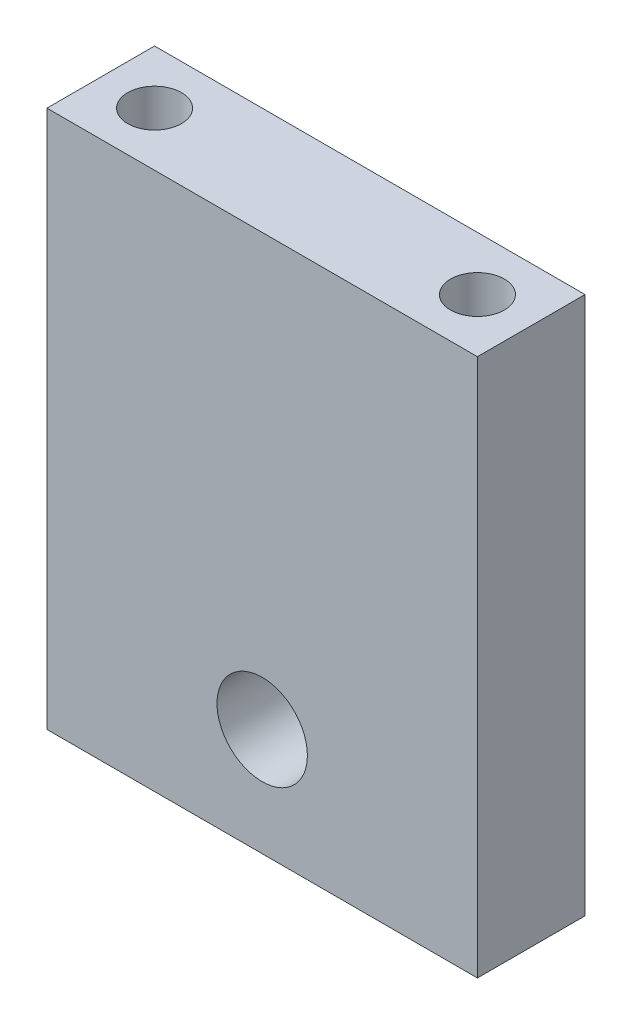
ISO-10303-21;
HEADER;
FILE_DESCRIPTION(('STEP AP214'),'2;1');
FILE_NAME('part.step','',(''),(''),'','','');
FILE_SCHEMA(('AUTOMOTIVE_DESIGN { 1 0 10303 214 1 1 1 1 }'));
ENDSEC;
DATA;
#1=APPLICATION_CONTEXT('core data for automotive mechanical design processes');
#2=APPLICATION_PROTOCOL_DEFINITION('international standard','automotive_design',2000,#1);
#3=PRODUCT_CONTEXT('',#1,'mechanical');
#4=PRODUCT('Part','Part','',(#3));
#5=PRODUCT_RELATED_PRODUCT_CATEGORY('part','',(#4));
#6=PRODUCT_DEFINITION_FORMATION('','',#4);
#7=PRODUCT_DEFINITION_CONTEXT('part definition',#1,'design');
#8=PRODUCT_DEFINITION('design','',#6,#7);
#9=PRODUCT_DEFINITION_SHAPE('','',#8);
#10=(LENGTH_UNIT() NAMED_UNIT(*) SI_UNIT(.MILLI.,.METRE.));
#11=(NAMED_UNIT(*) PLANE_ANGLE_UNIT() SI_UNIT($,.RADIAN.));
#12=(NAMED_UNIT(*) SI_UNIT($,.STERADIAN.) SOLID_ANGLE_UNIT());
#13=UNCERTAINTY_MEASURE_WITH_UNIT(LENGTH_MEASURE(1.E-05),#10,'distance_accuracy_value','');
#14=(GEOMETRIC_REPRESENTATION_CONTEXT(3) GLOBAL_UNCERTAINTY_ASSIGNED_CONTEXT((#13)) GLOBAL_UNIT_ASSIGNED_CONTEXT((#10,
#11,#12)) REPRESENTATION_CONTEXT('',''));
#15=CARTESIAN_POINT('',(0.,0.,0.));
#16=DIRECTION('',(0.,0.,1.));
#17=DIRECTION('',(1.,0.,0.));
#18=AXIS2_PLACEMENT_3D('',#15,#16,#17);
#19=CARTESIAN_POINT('',(10.,12.5,2.5));
#20=DIRECTION('',(-1.,0.,0.));
#21=DIRECTION('',(0.,-1.,0.));
#22=AXIS2_PLACEMENT_3D('',#19,#20,#21);
#23=PLANE('',#22);
#24=DIRECTION('',(0.,1.,0.));
#25=VECTOR('',#24,1.);
#26=CARTESIAN_POINT('',(10.,12.5,-2.5));
#27=LINE('',#26,#25);
#28=CARTESIAN_POINT('',(10.,-12.5,-2.5));
#29=VERTEX_POINT('',#28);
#30=CARTESIAN_POINT('',(10.,12.5,-2.5));
#31=VERTEX_POINT('',#30);
#32=EDGE_CURVE('E94',#29,#31,#27,.T.);
#33=ORIENTED_EDGE('',*,*,#32,.T.);
#34=DIRECTION('',(0.,0.,-1.));
#35=VECTOR('',#34,1.);
#36=CARTESIAN_POINT('',(10.,12.5,2.5));
#37=LINE('',#36,#35);
#38=CARTESIAN_POINT('',(10.,12.5,2.5));
#39=VERTEX_POINT('',#38);
#40=EDGE_CURVE('E11',#39,#31,#37,.T.);
#41=ORIENTED_EDGE('',*,*,#40,.F.);
#42=DIRECTION('',(0.,1.,0.));
#43=VECTOR('',#42,1.);
#44=CARTESIAN_POINT('',(10.,12.5,2.5));
#45=LINE('',#44,#43);
#46=CARTESIAN_POINT('',(10.,-12.5,2.5));
#47=VERTEX_POINT('',#46);
#48=EDGE_CURVE('E95',#47,#39,#45,.T.);
#49=ORIENTED_EDGE('',*,*,#48,.F.);
#50=DIRECTION('',(0.,0.,-1.));
#51=VECTOR('',#50,1.);
#52=CARTESIAN_POINT('',(10.,-12.5,2.5));
#53=LINE('',#52,#51);
#54=EDGE_CURVE('E101',#47,#29,#53,.T.);
#55=ORIENTED_EDGE('',*,*,#54,.T.);
#56=EDGE_LOOP('',(#33,#41,#49,#55));
#57=FACE_BOUND('',#56,.T.);
#58=ADVANCED_FACE('F17',(#57),#23,.F.);
#59=CARTESIAN_POINT('',(-10.,12.5,2.5));
#60=DIRECTION('',(0.,-1.,0.));
#61=DIRECTION('',(0.,0.,-1.));
#62=AXIS2_PLACEMENT_3D('',#59,#60,#61);
#63=PLANE('',#62);
#64=CARTESIAN_POINT('',(-7.5,12.5,0.));
#65=DIRECTION('',(0.,1.,0.));
#66=DIRECTION('',(0.,0.,1.));
#67=AXIS2_PLACEMENT_3D('',#64,#65,#66);
#68=CIRCLE('',#67,1.25);
#69=CARTESIAN_POINT('',(-7.5,12.5,1.25));
#70=VERTEX_POINT('',#69);
#71=EDGE_CURVE('E82',#70,#70,#68,.T.);
#72=ORIENTED_EDGE('',*,*,#71,.F.);
#73=EDGE_LOOP('',(#72));
#74=FACE_BOUND('',#73,.T.);
#75=CARTESIAN_POINT('',(7.5,12.5,0.));
#76=DIRECTION('',(0.,1.,0.));
#77=DIRECTION('',(0.,0.,1.));
#78=AXIS2_PLACEMENT_3D('',#75,#76,#77);
#79=CIRCLE('',#78,1.25);
#80=CARTESIAN_POINT('',(7.5,12.5,1.25));
#81=VERTEX_POINT('',#80);
#82=EDGE_CURVE('E81',#81,#81,#79,.T.);
#83=ORIENTED_EDGE('',*,*,#82,.F.);
#84=EDGE_LOOP('',(#83));
#85=FACE_BOUND('',#84,.T.);
#86=DIRECTION('',(-1.,0.,0.));
#87=VECTOR('',#86,1.);
#88=CARTESIAN_POINT('',(-10.,12.5,-2.5));
#89=LINE('',#88,#87);
#90=CARTESIAN_POINT('',(-10.,12.5,-2.5));
#91=VERTEX_POINT('',#90);
#92=EDGE_CURVE('E104',#31,#91,#89,.T.);
#93=ORIENTED_EDGE('',*,*,#92,.T.);
#94=DIRECTION('',(0.,0.,-1.));
#95=VECTOR('',#94,1.);
#96=CARTESIAN_POINT('',(-10.,12.5,2.5));
#97=LINE('',#96,#95);
#98=CARTESIAN_POINT('',(-10.,12.5,2.5));
#99=VERTEX_POINT('',#98);
#100=EDGE_CURVE('E25',#99,#91,#97,.T.);
#101=ORIENTED_EDGE('',*,*,#100,.F.);
#102=DIRECTION('',(-1.,0.,0.));
#103=VECTOR('',#102,1.);
#104=CARTESIAN_POINT('',(-10.,12.5,2.5));
#105=LINE('',#104,#103);
#106=EDGE_CURVE('E64',#39,#99,#105,.T.);
#107=ORIENTED_EDGE('',*,*,#106,.F.);
#108=ORIENTED_EDGE('',*,*,#40,.T.);
#109=EDGE_LOOP('',(#93,#101,#107,#108));
#110=FACE_BOUND('',#109,.T.);
#111=ADVANCED_FACE('F130',(#74,#85,#110),#63,.F.);
#112=CARTESIAN_POINT('',(-10.,12.5,2.5));
#113=DIRECTION('',(1.,0.,0.));
#114=DIRECTION('',(0.,1.,0.));
#115=AXIS2_PLACEMENT_3D('',#112,#113,#114);
#116=PLANE('',#115);
#117=DIRECTION('',(0.,-1.,0.));
#118=VECTOR('',#117,1.);
#119=CARTESIAN_POINT('',(-10.,12.5,-2.5));
#120=LINE('',#119,#118);
#121=CARTESIAN_POINT('',(-10.,-12.5,-2.5));
#122=VERTEX_POINT('',#121);
#123=EDGE_CURVE('E51',#91,#122,#120,.T.);
#124=ORIENTED_EDGE('',*,*,#123,.T.);
#125=DIRECTION('',(0.,0.,-1.));
#126=VECTOR('',#125,1.);
#127=CARTESIAN_POINT('',(-10.,-12.5,2.5));
#128=LINE('',#127,#126);
#129=CARTESIAN_POINT('',(-10.,-12.5,2.5));
#130=VERTEX_POINT('',#129);
#131=EDGE_CURVE('E109',#130,#122,#128,.T.);
#132=ORIENTED_EDGE('',*,*,#131,.F.);
#133=DIRECTION('',(0.,-1.,0.));
#134=VECTOR('',#133,1.);
#135=CARTESIAN_POINT('',(-10.,12.5,2.5));
#136=LINE('',#135,#134);
#137=EDGE_CURVE('E98',#99,#130,#136,.T.);
#138=ORIENTED_EDGE('',*,*,#137,.F.);
#139=ORIENTED_EDGE('',*,*,#100,.T.);
#140=EDGE_LOOP('',(#124,#132,#138,#139));
#141=FACE_BOUND('',#140,.T.);
#142=ADVANCED_FACE('F111',(#141),#116,.F.);
#143=CARTESIAN_POINT('',(-10.,-12.5,2.5));
#144=DIRECTION('',(0.,1.,0.));
#145=DIRECTION('',(0.,0.,1.));
#146=AXIS2_PLACEMENT_3D('',#143,#144,#145);
#147=PLANE('',#146);
#148=DIRECTION('',(1.,0.,0.));
#149=VECTOR('',#148,1.);
#150=CARTESIAN_POINT('',(-10.,-12.5,-2.5));
#151=LINE('',#150,#149);
#152=EDGE_CURVE('E57',#122,#29,#151,.T.);
#153=ORIENTED_EDGE('',*,*,#152,.T.);
#154=ORIENTED_EDGE('',*,*,#54,.F.);
#155=DIRECTION('',(1.,0.,0.));
#156=VECTOR('',#155,1.);
#157=CARTESIAN_POINT('',(-10.,-12.5,2.5));
#158=LINE('',#157,#156);
#159=EDGE_CURVE('E33',#130,#47,#158,.T.);
#160=ORIENTED_EDGE('',*,*,#159,.F.);
#161=ORIENTED_EDGE('',*,*,#131,.T.);
#162=EDGE_LOOP('',(#153,#154,#160,#161));
#163=FACE_BOUND('',#162,.T.);
#164=ADVANCED_FACE('F118',(#163),#147,.F.);
#165=CARTESIAN_POINT('',(0.,0.,2.5));
#166=DIRECTION('',(0.,0.,1.));
#167=DIRECTION('',(1.,0.,0.));
#168=AXIS2_PLACEMENT_3D('',#165,#166,#167);
#169=PLANE('',#168);
#170=CARTESIAN_POINT('',(0.,-7.5,2.5));
#171=DIRECTION('',(0.,0.,1.));
#172=DIRECTION('',(1.,0.,0.));
#173=AXIS2_PLACEMENT_3D('',#170,#171,#172);
#174=CIRCLE('',#173,2.1);
#175=CARTESIAN_POINT('',(2.1,-7.5,2.5));
#176=VERTEX_POINT('',#175);
#177=EDGE_CURVE('E167',#176,#176,#174,.T.);
#178=ORIENTED_EDGE('',*,*,#177,.F.);
#179=EDGE_LOOP('',(#178));
#180=FACE_BOUND('',#179,.T.);
#181=ORIENTED_EDGE('',*,*,#48,.T.);
#182=ORIENTED_EDGE('',*,*,#106,.T.);
#183=ORIENTED_EDGE('',*,*,#137,.T.);
#184=ORIENTED_EDGE('',*,*,#159,.T.);
#185=EDGE_LOOP('',(#181,#182,#183,#184));
#186=FACE_BOUND('',#185,.T.);
#187=ADVANCED_FACE('F120',(#180,#186),#169,.T.);
#188=CARTESIAN_POINT('',(0.,0.,-2.5));
#189=DIRECTION('',(0.,0.,1.));
#190=DIRECTION('',(1.,0.,0.));
#191=AXIS2_PLACEMENT_3D('',#188,#189,#190);
#192=PLANE('',#191);
#193=CARTESIAN_POINT('',(0.,-7.5,-2.5));
#194=DIRECTION('',(0.,0.,1.));
#195=DIRECTION('',(1.,0.,0.));
#196=AXIS2_PLACEMENT_3D('',#193,#194,#195);
#197=CIRCLE('',#196,2.1);
#198=CARTESIAN_POINT('',(2.1,-7.5,-2.5));
#199=VERTEX_POINT('',#198);
#200=EDGE_CURVE('E88',#199,#199,#197,.T.);
#201=ORIENTED_EDGE('',*,*,#200,.T.);
#202=EDGE_LOOP('',(#201));
#203=FACE_BOUND('',#202,.T.);
#204=ORIENTED_EDGE('',*,*,#32,.F.);
#205=ORIENTED_EDGE('',*,*,#152,.F.);
#206=ORIENTED_EDGE('',*,*,#123,.F.);
#207=ORIENTED_EDGE('',*,*,#92,.F.);
#208=EDGE_LOOP('',(#204,#205,#206,#207));
#209=FACE_BOUND('',#208,.T.);
#210=ADVANCED_FACE('F114',(#203,#209),#192,.F.);
#211=CARTESIAN_POINT('',(7.5,5.,0.));
#212=DIRECTION('',(0.,1.,0.));
#213=DIRECTION('',(0.,0.,1.));
#214=AXIS2_PLACEMENT_3D('',#211,#212,#213);
#215=CONICAL_SURFACE('',#214,1.24999999999999,1.02974425867664);
#216=CARTESIAN_POINT('',(7.5,4.24892422621555,0.));
#217=VERTEX_POINT('',#216);
#218=VERTEX_LOOP('',#217);
#219=FACE_BOUND('',#218,.T.);
#220=CARTESIAN_POINT('',(7.5,5.,0.));
#221=DIRECTION('',(0.,1.,0.));
#222=DIRECTION('',(0.,0.,1.));
#223=AXIS2_PLACEMENT_3D('',#220,#221,#222);
#224=CIRCLE('',#223,1.24999999999999);
#225=CARTESIAN_POINT('',(7.5,5.,1.24999999999998));
#226=VERTEX_POINT('',#225);
#227=EDGE_CURVE('E85',#226,#226,#224,.T.);
#228=ORIENTED_EDGE('',*,*,#227,.T.);
#229=EDGE_LOOP('',(#228));
#230=FACE_BOUND('',#229,.T.);
#231=ADVANCED_FACE('F147',(#219,#230),#215,.F.);
#232=CARTESIAN_POINT('',(7.5,12.5,0.));
#233=DIRECTION('',(0.,1.,0.));
#234=DIRECTION('',(0.,0.,1.));
#235=AXIS2_PLACEMENT_3D('',#232,#233,#234);
#236=CYLINDRICAL_SURFACE('',#235,1.24999999999999);
#237=ORIENTED_EDGE('',*,*,#227,.F.);
#238=EDGE_LOOP('',(#237));
#239=FACE_BOUND('',#238,.T.);
#240=ORIENTED_EDGE('',*,*,#82,.T.);
#241=EDGE_LOOP('',(#240));
#242=FACE_BOUND('',#241,.T.);
#243=ADVANCED_FACE('F75',(#239,#242),#236,.F.);
#244=CARTESIAN_POINT('',(-7.5,5.,0.));
#245=DIRECTION('',(0.,1.,0.));
#246=DIRECTION('',(0.,0.,1.));
#247=AXIS2_PLACEMENT_3D('',#244,#245,#246);
#248=CONICAL_SURFACE('',#247,1.24999999999999,1.02974425867664);
#249=CARTESIAN_POINT('',(-7.5,4.24892422621555,0.));
#250=VERTEX_POINT('',#249);
#251=VERTEX_LOOP('',#250);
#252=FACE_BOUND('',#251,.T.);
#253=CARTESIAN_POINT('',(-7.5,5.,0.));
#254=DIRECTION('',(0.,1.,0.));
#255=DIRECTION('',(0.,0.,1.));
#256=AXIS2_PLACEMENT_3D('',#253,#254,#255);
#257=CIRCLE('',#256,1.24999999999999);
#258=CARTESIAN_POINT('',(-7.5,5.,1.24999999999999));
#259=VERTEX_POINT('',#258);
#260=EDGE_CURVE('E79',#259,#259,#257,.T.);
#261=ORIENTED_EDGE('',*,*,#260,.T.);
#262=EDGE_LOOP('',(#261));
#263=FACE_BOUND('',#262,.T.);
#264=ADVANCED_FACE('F71',(#252,#263),#248,.F.);
#265=CARTESIAN_POINT('',(-7.5,12.5,0.));
#266=DIRECTION('',(0.,1.,0.));
#267=DIRECTION('',(0.,0.,1.));
#268=AXIS2_PLACEMENT_3D('',#265,#266,#267);
#269=CYLINDRICAL_SURFACE('',#268,1.24999999999999);
#270=ORIENTED_EDGE('',*,*,#260,.F.);
#271=EDGE_LOOP('',(#270));
#272=FACE_BOUND('',#271,.T.);
#273=ORIENTED_EDGE('',*,*,#71,.T.);
#274=EDGE_LOOP('',(#273));
#275=FACE_BOUND('',#274,.T.);
#276=ADVANCED_FACE('F74',(#272,#275),#269,.F.);
#277=CARTESIAN_POINT('',(0.,-7.5,2.5));
#278=DIRECTION('',(0.,0.,1.));
#279=DIRECTION('',(1.,0.,0.));
#280=AXIS2_PLACEMENT_3D('',#277,#278,#279);
#281=CYLINDRICAL_SURFACE('',#280,2.1);
#282=ORIENTED_EDGE('',*,*,#200,.F.);
#283=EDGE_LOOP('',(#282));
#284=FACE_BOUND('',#283,.T.);
#285=ORIENTED_EDGE('',*,*,#177,.T.);
#286=EDGE_LOOP('',(#285));
#287=FACE_BOUND('',#286,.T.);
#288=ADVANCED_FACE('F172',(#284,#287),#281,.F.);
#289=CLOSED_SHELL('',(#58,#111,#142,#164,#187,#210,#231,#243,#264,#276,#288));
#290=MANIFOLD_SOLID_BREP('B1',#289);
#291=ADVANCED_BREP_SHAPE_REPRESENTATION('',(#18,#290),#14);
#292=SHAPE_DEFINITION_REPRESENTATION(#9,#291);
ENDSEC;
END-ISO-10303-21;
